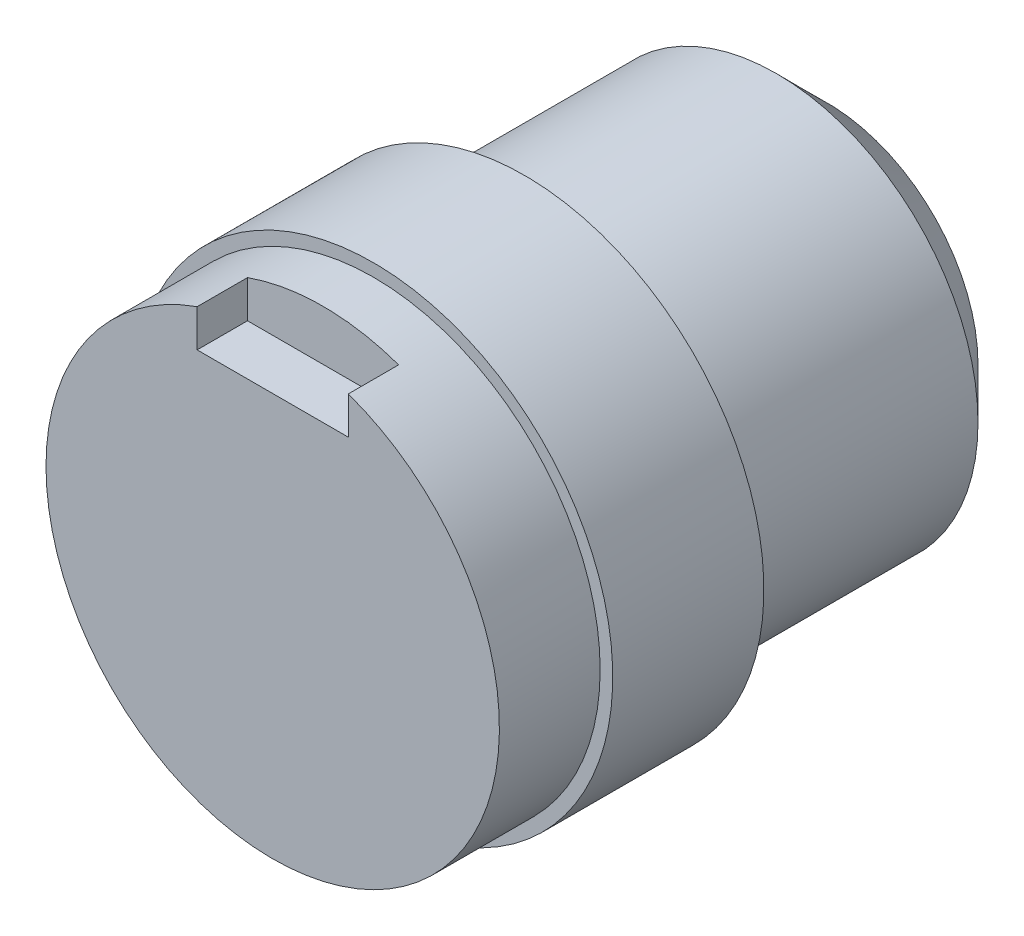
ISO-10303-21;
HEADER;
FILE_DESCRIPTION(('STEP AP214'),'2;1');
FILE_NAME('part.step','',(''),(''),'','','');
FILE_SCHEMA(('AUTOMOTIVE_DESIGN { 1 0 10303 214 1 1 1 1 }'));
ENDSEC;
DATA;
#1=APPLICATION_CONTEXT('core data for automotive mechanical design processes');
#2=APPLICATION_PROTOCOL_DEFINITION('international standard','automotive_design',2000,#1);
#3=PRODUCT_CONTEXT('',#1,'mechanical');
#4=PRODUCT('Part','Part','',(#3));
#5=PRODUCT_RELATED_PRODUCT_CATEGORY('part','',(#4));
#6=PRODUCT_DEFINITION_FORMATION('','',#4);
#7=PRODUCT_DEFINITION_CONTEXT('part definition',#1,'design');
#8=PRODUCT_DEFINITION('design','',#6,#7);
#9=PRODUCT_DEFINITION_SHAPE('','',#8);
#10=(LENGTH_UNIT() NAMED_UNIT(*) SI_UNIT(.MILLI.,.METRE.));
#11=(NAMED_UNIT(*) PLANE_ANGLE_UNIT() SI_UNIT($,.RADIAN.));
#12=(NAMED_UNIT(*) SI_UNIT($,.STERADIAN.) SOLID_ANGLE_UNIT());
#13=UNCERTAINTY_MEASURE_WITH_UNIT(LENGTH_MEASURE(1.E-05),#10,'distance_accuracy_value','');
#14=(GEOMETRIC_REPRESENTATION_CONTEXT(3) GLOBAL_UNCERTAINTY_ASSIGNED_CONTEXT((#13)) GLOBAL_UNIT_ASSIGNED_CONTEXT((#10,
#11,#12)) REPRESENTATION_CONTEXT('',''));
#15=CARTESIAN_POINT('',(0.,0.,0.));
#16=DIRECTION('',(0.,0.,1.));
#17=DIRECTION('',(1.,0.,0.));
#18=AXIS2_PLACEMENT_3D('',#15,#16,#17);
#19=CARTESIAN_POINT('',(0.,0.,6.));
#20=DIRECTION('',(0.,0.,1.));
#21=DIRECTION('',(1.,0.,0.));
#22=AXIS2_PLACEMENT_3D('',#19,#20,#21);
#23=PLANE('',#22);
#24=CARTESIAN_POINT('',(0.,0.,6.));
#25=DIRECTION('',(0.,0.,1.));
#26=DIRECTION('',(1.,0.,0.));
#27=AXIS2_PLACEMENT_3D('',#24,#25,#26);
#28=CIRCLE('',#27,4.);
#29=CARTESIAN_POINT('',(-4.,0.,6.));
#30=VERTEX_POINT('',#29);
#31=EDGE_CURVE('P0_E25',#30,#30,#28,.T.);
#32=ORIENTED_EDGE('',*,*,#31,.T.);
#33=EDGE_LOOP('',(#32));
#34=FACE_BOUND('',#33,.T.);
#35=ADVANCED_FACE('P0_F17',(#34),#23,.T.);
#36=CARTESIAN_POINT('',(0.,0.,0.));
#37=DIRECTION('',(0.,0.,1.));
#38=DIRECTION('',(1.,0.,0.));
#39=AXIS2_PLACEMENT_3D('',#36,#37,#38);
#40=PLANE('',#39);
#41=CARTESIAN_POINT('',(0.,0.,0.));
#42=DIRECTION('',(0.,0.,1.));
#43=DIRECTION('',(1.,0.,0.));
#44=AXIS2_PLACEMENT_3D('',#41,#42,#43);
#45=CIRCLE('',#44,3.);
#46=CARTESIAN_POINT('',(-3.,0.,0.));
#47=VERTEX_POINT('',#46);
#48=EDGE_CURVE('P0_E44',#47,#47,#45,.T.);
#49=ORIENTED_EDGE('',*,*,#48,.F.);
#50=EDGE_LOOP('',(#49));
#51=FACE_BOUND('',#50,.T.);
#52=ADVANCED_FACE('P0_F68',(#51),#40,.F.);
#53=CARTESIAN_POINT('',(0.,0.,0.));
#54=DIRECTION('',(0.,0.,1.));
#55=DIRECTION('',(1.,0.,0.));
#56=AXIS2_PLACEMENT_3D('',#53,#54,#55);
#57=CYLINDRICAL_SURFACE('',#56,4.);
#58=ORIENTED_EDGE('',*,*,#31,.F.);
#59=DIRECTION('',(0.,0.,-1.));
#60=VECTOR('',#59,1.);
#61=CARTESIAN_POINT('',(-4.,0.,0.));
#62=LINE('',#61,#60);
#63=CARTESIAN_POINT('',(-4.,0.,1.));
#64=VERTEX_POINT('',#63);
#65=EDGE_CURVE('P0_E11',#30,#64,#62,.T.);
#66=ORIENTED_EDGE('',*,*,#65,.T.);
#67=CARTESIAN_POINT('',(0.,0.,1.));
#68=DIRECTION('',(0.,0.,-1.));
#69=DIRECTION('',(1.,0.,0.));
#70=AXIS2_PLACEMENT_3D('',#67,#68,#69);
#71=CIRCLE('',#70,4.);
#72=EDGE_CURVE('P0_E51',#64,#64,#71,.T.);
#73=ORIENTED_EDGE('',*,*,#72,.F.);
#74=ORIENTED_EDGE('',*,*,#65,.F.);
#75=EDGE_LOOP('',(#58,#66,#73,#74));
#76=FACE_BOUND('',#75,.T.);
#77=ADVANCED_FACE('P0_F47',(#76),#57,.T.);
#78=CARTESIAN_POINT('',(0.,0.,0.5));
#79=DIRECTION('',(0.,0.,1.));
#80=DIRECTION('',(1.,0.,0.));
#81=AXIS2_PLACEMENT_3D('',#78,#79,#80);
#82=CONICAL_SURFACE('',#81,3.5,0.785398163397448);
#83=ORIENTED_EDGE('',*,*,#72,.T.);
#84=DIRECTION('',(0.707106781186547,0.,-0.707106781186548));
#85=VECTOR('',#84,1.);
#86=CARTESIAN_POINT('',(-3.5,0.,0.5));
#87=LINE('',#86,#85);
#88=EDGE_CURVE('P0_E55',#64,#47,#87,.T.);
#89=ORIENTED_EDGE('',*,*,#88,.T.);
#90=ORIENTED_EDGE('',*,*,#48,.T.);
#91=ORIENTED_EDGE('',*,*,#88,.F.);
#92=EDGE_LOOP('',(#83,#89,#90,#91));
#93=FACE_BOUND('',#92,.T.);
#94=ADVANCED_FACE('P0_F52',(#93),#82,.T.);
#95=CLOSED_SHELL('',(#35,#52,#77,#94));
#96=MANIFOLD_SOLID_BREP('P0_B1',#95);
#97=CARTESIAN_POINT('',(0.,0.,6.));
#98=DIRECTION('',(0.,0.,1.));
#99=DIRECTION('',(1.,0.,0.));
#100=AXIS2_PLACEMENT_3D('',#97,#98,#99);
#101=PLANE('',#100);
#102=CARTESIAN_POINT('',(0.,0.,6.));
#103=DIRECTION('',(0.,0.,1.));
#104=DIRECTION('',(1.,0.,0.));
#105=AXIS2_PLACEMENT_3D('',#102,#103,#104);
#106=CIRCLE('',#105,4.75);
#107=CARTESIAN_POINT('',(-4.75,0.,6.));
#108=VERTEX_POINT('',#107);
#109=EDGE_CURVE('P1_E10',#108,#108,#106,.T.);
#110=ORIENTED_EDGE('',*,*,#109,.F.);
#111=EDGE_LOOP('',(#110));
#112=FACE_BOUND('',#111,.T.);
#113=ADVANCED_FACE('P1_F16',(#112),#101,.F.);
#114=CARTESIAN_POINT('',(0.,0.,9.));
#115=DIRECTION('',(0.,0.,1.));
#116=DIRECTION('',(1.,0.,0.));
#117=AXIS2_PLACEMENT_3D('',#114,#115,#116);
#118=PLANE('',#117);
#119=CARTESIAN_POINT('',(0.,0.,9.));
#120=DIRECTION('',(0.,0.,-1.));
#121=DIRECTION('',(1.,0.,0.));
#122=AXIS2_PLACEMENT_3D('',#119,#120,#121);
#123=CIRCLE('',#122,4.5);
#124=CARTESIAN_POINT('',(-4.5,0.,9.));
#125=VERTEX_POINT('',#124);
#126=EDGE_CURVE('P1_E63',#125,#125,#123,.T.);
#127=ORIENTED_EDGE('',*,*,#126,.T.);
#128=EDGE_LOOP('',(#127));
#129=FACE_BOUND('',#128,.T.);
#130=CARTESIAN_POINT('',(0.,0.,9.));
#131=DIRECTION('',(0.,0.,1.));
#132=DIRECTION('',(1.,0.,0.));
#133=AXIS2_PLACEMENT_3D('',#130,#131,#132);
#134=CIRCLE('',#133,4.75);
#135=CARTESIAN_POINT('',(-4.75,0.,9.));
#136=VERTEX_POINT('',#135);
#137=EDGE_CURVE('P1_E80',#136,#136,#134,.T.);
#138=ORIENTED_EDGE('',*,*,#137,.T.);
#139=EDGE_LOOP('',(#138));
#140=FACE_BOUND('',#139,.T.);
#141=ADVANCED_FACE('P1_F65',(#129,#140),#118,.T.);
#142=CARTESIAN_POINT('',(0.,0.,6.));
#143=DIRECTION('',(0.,0.,1.));
#144=DIRECTION('',(1.,0.,0.));
#145=AXIS2_PLACEMENT_3D('',#142,#143,#144);
#146=CYLINDRICAL_SURFACE('',#145,4.75);
#147=ORIENTED_EDGE('',*,*,#137,.F.);
#148=DIRECTION('',(0.,0.,-1.));
#149=VECTOR('',#148,1.);
#150=CARTESIAN_POINT('',(-4.75,0.,6.));
#151=LINE('',#150,#149);
#152=EDGE_CURVE('P1_E25',#136,#108,#151,.T.);
#153=ORIENTED_EDGE('',*,*,#152,.T.);
#154=ORIENTED_EDGE('',*,*,#109,.T.);
#155=ORIENTED_EDGE('',*,*,#152,.F.);
#156=EDGE_LOOP('',(#147,#153,#154,#155));
#157=FACE_BOUND('',#156,.T.);
#158=ADVANCED_FACE('P1_F223',(#157),#146,.T.);
#159=CARTESIAN_POINT('',(0.,0.,11.));
#160=DIRECTION('',(0.,0.,1.));
#161=DIRECTION('',(1.,0.,0.));
#162=AXIS2_PLACEMENT_3D('',#159,#160,#161);
#163=PLANE('',#162);
#164=DIRECTION('',(0.,1.,0.));
#165=VECTOR('',#164,1.);
#166=CARTESIAN_POINT('',(-1.5,1.75,11.));
#167=LINE('',#166,#165);
#168=CARTESIAN_POINT('',(-1.5,3.5,11.));
#169=VERTEX_POINT('',#168);
#170=CARTESIAN_POINT('',(-1.5,4.24264068711928,11.));
#171=VERTEX_POINT('',#170);
#172=EDGE_CURVE('P1_E176',#169,#171,#167,.T.);
#173=ORIENTED_EDGE('',*,*,#172,.T.);
#174=CARTESIAN_POINT('',(0.,0.,11.));
#175=DIRECTION('',(0.,0.,1.));
#176=DIRECTION('',(1.,0.,0.));
#177=AXIS2_PLACEMENT_3D('',#174,#175,#176);
#178=CIRCLE('',#177,4.5);
#179=CARTESIAN_POINT('',(-4.5,0.,11.));
#180=VERTEX_POINT('',#179);
#181=EDGE_CURVE('P1_E60',#171,#180,#178,.T.);
#182=ORIENTED_EDGE('',*,*,#181,.T.);
#183=CARTESIAN_POINT('',(0.,0.,11.));
#184=DIRECTION('',(0.,0.,1.));
#185=DIRECTION('',(1.,0.,0.));
#186=AXIS2_PLACEMENT_3D('',#183,#184,#185);
#187=CIRCLE('',#186,4.5);
#188=CARTESIAN_POINT('',(1.5,4.24264068711928,11.));
#189=VERTEX_POINT('',#188);
#190=EDGE_CURVE('P1_E78',#180,#189,#187,.T.);
#191=ORIENTED_EDGE('',*,*,#190,.T.);
#192=DIRECTION('',(0.,-1.,0.));
#193=VECTOR('',#192,1.);
#194=CARTESIAN_POINT('',(1.5,2.12132034355964,11.));
#195=LINE('',#194,#193);
#196=CARTESIAN_POINT('',(1.5,3.5,11.));
#197=VERTEX_POINT('',#196);
#198=EDGE_CURVE('P1_E97',#189,#197,#195,.T.);
#199=ORIENTED_EDGE('',*,*,#198,.T.);
#200=DIRECTION('',(-1.,0.,0.));
#201=VECTOR('',#200,1.);
#202=CARTESIAN_POINT('',(0.75,3.5,11.));
#203=LINE('',#202,#201);
#204=EDGE_CURVE('P1_E142',#197,#169,#203,.T.);
#205=ORIENTED_EDGE('',*,*,#204,.T.);
#206=EDGE_LOOP('',(#173,#182,#191,#199,#205));
#207=FACE_BOUND('',#206,.T.);
#208=ADVANCED_FACE('P1_F115',(#207),#163,.T.);
#209=CARTESIAN_POINT('',(0.,0.,9.));
#210=DIRECTION('',(0.,0.,1.));
#211=DIRECTION('',(1.,0.,0.));
#212=AXIS2_PLACEMENT_3D('',#209,#210,#211);
#213=CYLINDRICAL_SURFACE('',#212,4.5);
#214=DIRECTION('',(0.,0.,-1.));
#215=VECTOR('',#214,1.);
#216=CARTESIAN_POINT('',(-1.5,4.24264068711929,9.));
#217=LINE('',#216,#215);
#218=CARTESIAN_POINT('',(-1.5,4.24264068711928,10.));
#219=VERTEX_POINT('',#218);
#220=EDGE_CURVE('P1_E136',#171,#219,#217,.T.);
#221=ORIENTED_EDGE('',*,*,#220,.T.);
#222=CARTESIAN_POINT('',(0.,0.,10.));
#223=DIRECTION('',(0.,0.,-1.));
#224=DIRECTION('',(1.,0.,0.));
#225=AXIS2_PLACEMENT_3D('',#222,#223,#224);
#226=CIRCLE('',#225,4.5);
#227=CARTESIAN_POINT('',(1.5,4.24264068711928,10.));
#228=VERTEX_POINT('',#227);
#229=EDGE_CURVE('P1_E104',#219,#228,#226,.T.);
#230=ORIENTED_EDGE('',*,*,#229,.T.);
#231=DIRECTION('',(0.,0.,1.));
#232=VECTOR('',#231,1.);
#233=CARTESIAN_POINT('',(1.5,4.24264068711928,9.));
#234=LINE('',#233,#232);
#235=EDGE_CURVE('P1_E99',#228,#189,#234,.T.);
#236=ORIENTED_EDGE('',*,*,#235,.T.);
#237=ORIENTED_EDGE('',*,*,#190,.F.);
#238=DIRECTION('',(0.,0.,-1.));
#239=VECTOR('',#238,1.);
#240=CARTESIAN_POINT('',(-4.5,0.,9.));
#241=LINE('',#240,#239);
#242=EDGE_CURVE('P1_E69',#180,#125,#241,.T.);
#243=ORIENTED_EDGE('',*,*,#242,.T.);
#244=ORIENTED_EDGE('',*,*,#126,.F.);
#245=ORIENTED_EDGE('',*,*,#242,.F.);
#246=ORIENTED_EDGE('',*,*,#181,.F.);
#247=EDGE_LOOP('',(#221,#230,#236,#237,#243,#244,#245,#246));
#248=FACE_BOUND('',#247,.T.);
#249=ADVANCED_FACE('P1_F118',(#248),#213,.T.);
#250=CARTESIAN_POINT('',(0.,4.,10.));
#251=DIRECTION('',(0.,0.,1.));
#252=DIRECTION('',(1.,0.,0.));
#253=AXIS2_PLACEMENT_3D('',#250,#251,#252);
#254=PLANE('',#253);
#255=ORIENTED_EDGE('',*,*,#229,.F.);
#256=DIRECTION('',(0.,1.,0.));
#257=VECTOR('',#256,1.);
#258=CARTESIAN_POINT('',(-1.5,3.5,10.));
#259=LINE('',#258,#257);
#260=CARTESIAN_POINT('',(-1.5,3.5,10.));
#261=VERTEX_POINT('',#260);
#262=EDGE_CURVE('P1_E134',#261,#219,#259,.T.);
#263=ORIENTED_EDGE('',*,*,#262,.F.);
#264=DIRECTION('',(-1.,0.,0.));
#265=VECTOR('',#264,1.);
#266=CARTESIAN_POINT('',(1.5,3.5,10.));
#267=LINE('',#266,#265);
#268=CARTESIAN_POINT('',(1.5,3.5,10.));
#269=VERTEX_POINT('',#268);
#270=EDGE_CURVE('P1_E92',#269,#261,#267,.T.);
#271=ORIENTED_EDGE('',*,*,#270,.F.);
#272=DIRECTION('',(0.,-1.,0.));
#273=VECTOR('',#272,1.);
#274=CARTESIAN_POINT('',(1.5,4.5,10.));
#275=LINE('',#274,#273);
#276=EDGE_CURVE('P1_E102',#228,#269,#275,.T.);
#277=ORIENTED_EDGE('',*,*,#276,.F.);
#278=EDGE_LOOP('',(#255,#263,#271,#277));
#279=FACE_BOUND('',#278,.T.);
#280=ADVANCED_FACE('P1_F147',(#279),#254,.T.);
#281=CARTESIAN_POINT('',(1.5,4.24264068711928,11.));
#282=DIRECTION('',(1.,0.,0.));
#283=DIRECTION('',(0.,1.,0.));
#284=AXIS2_PLACEMENT_3D('',#281,#282,#283);
#285=PLANE('',#284);
#286=ORIENTED_EDGE('',*,*,#198,.F.);
#287=ORIENTED_EDGE('',*,*,#235,.F.);
#288=ORIENTED_EDGE('',*,*,#276,.T.);
#289=DIRECTION('',(0.,0.,-1.));
#290=VECTOR('',#289,1.);
#291=CARTESIAN_POINT('',(1.5,3.5,11.));
#292=LINE('',#291,#290);
#293=EDGE_CURVE('P1_E91',#197,#269,#292,.T.);
#294=ORIENTED_EDGE('',*,*,#293,.F.);
#295=EDGE_LOOP('',(#286,#287,#288,#294));
#296=FACE_BOUND('',#295,.T.);
#297=ADVANCED_FACE('P1_F122',(#296),#285,.F.);
#298=CARTESIAN_POINT('',(1.5,3.5,11.));
#299=DIRECTION('',(0.,-1.,0.));
#300=DIRECTION('',(0.,0.,-1.));
#301=AXIS2_PLACEMENT_3D('',#298,#299,#300);
#302=PLANE('',#301);
#303=ORIENTED_EDGE('',*,*,#204,.F.);
#304=ORIENTED_EDGE('',*,*,#293,.T.);
#305=ORIENTED_EDGE('',*,*,#270,.T.);
#306=DIRECTION('',(0.,0.,-1.));
#307=VECTOR('',#306,1.);
#308=CARTESIAN_POINT('',(-1.5,3.5,11.));
#309=LINE('',#308,#307);
#310=EDGE_CURVE('P1_E132',#169,#261,#309,.T.);
#311=ORIENTED_EDGE('',*,*,#310,.F.);
#312=EDGE_LOOP('',(#303,#304,#305,#311));
#313=FACE_BOUND('',#312,.T.);
#314=ADVANCED_FACE('P1_F154',(#313),#302,.F.);
#315=CARTESIAN_POINT('',(-1.5,3.5,11.));
#316=DIRECTION('',(-1.,0.,0.));
#317=DIRECTION('',(0.,1.,0.));
#318=AXIS2_PLACEMENT_3D('',#315,#316,#317);
#319=PLANE('',#318);
#320=ORIENTED_EDGE('',*,*,#172,.F.);
#321=ORIENTED_EDGE('',*,*,#310,.T.);
#322=ORIENTED_EDGE('',*,*,#262,.T.);
#323=ORIENTED_EDGE('',*,*,#220,.F.);
#324=EDGE_LOOP('',(#320,#321,#322,#323));
#325=FACE_BOUND('',#324,.T.);
#326=ADVANCED_FACE('P1_F194',(#325),#319,.F.);
#327=CLOSED_SHELL('',(#113,#141,#158,#208,#249,#280,#297,#314,#326));
#328=MANIFOLD_SOLID_BREP('P1_B1',#327);
#329=ADVANCED_BREP_SHAPE_REPRESENTATION('',(#18,#96,#328),#14);
#330=SHAPE_DEFINITION_REPRESENTATION(#9,#329);
ENDSEC;
END-ISO-10303-21;
